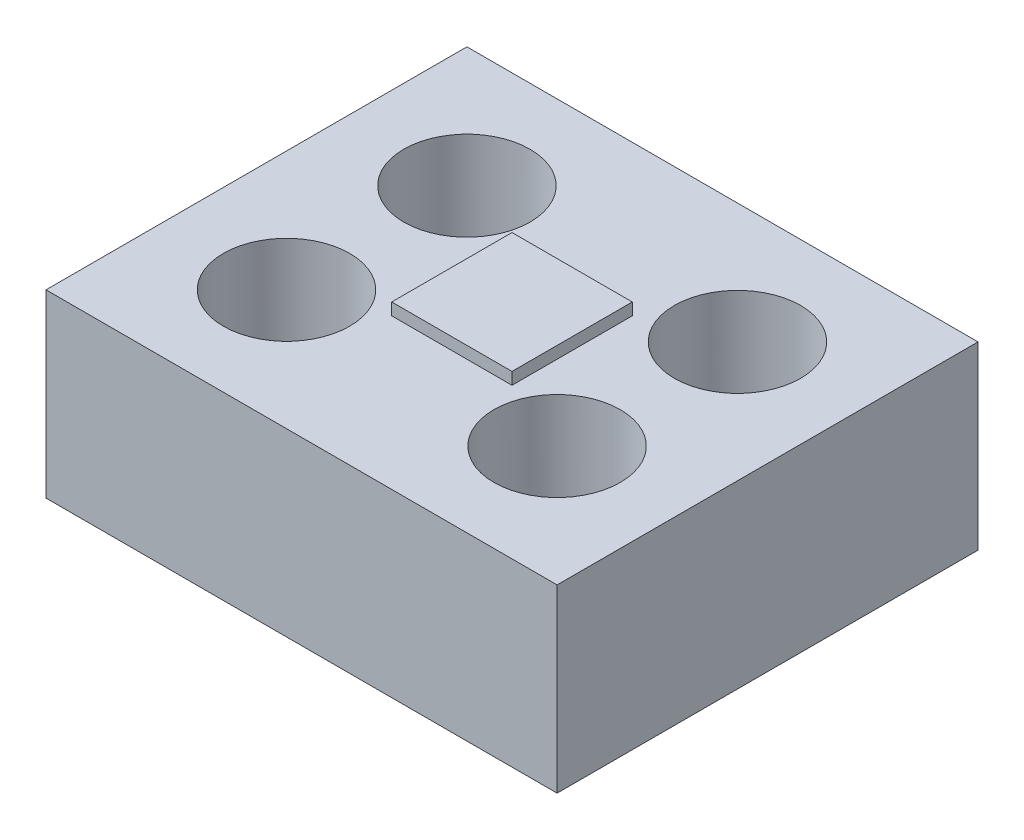
ISO-10303-21;
HEADER;
FILE_DESCRIPTION(('STEP AP214'),'2;1');
FILE_NAME('part.step','',(''),(''),'','','');
FILE_SCHEMA(('AUTOMOTIVE_DESIGN { 1 0 10303 214 1 1 1 1 }'));
ENDSEC;
DATA;
#1=APPLICATION_CONTEXT('core data for automotive mechanical design processes');
#2=APPLICATION_PROTOCOL_DEFINITION('international standard','automotive_design',2000,#1);
#3=PRODUCT_CONTEXT('',#1,'mechanical');
#4=PRODUCT('Part','Part','',(#3));
#5=PRODUCT_RELATED_PRODUCT_CATEGORY('part','',(#4));
#6=PRODUCT_DEFINITION_FORMATION('','',#4);
#7=PRODUCT_DEFINITION_CONTEXT('part definition',#1,'design');
#8=PRODUCT_DEFINITION('design','',#6,#7);
#9=PRODUCT_DEFINITION_SHAPE('','',#8);
#10=(LENGTH_UNIT() NAMED_UNIT(*) SI_UNIT(.MILLI.,.METRE.));
#11=(NAMED_UNIT(*) PLANE_ANGLE_UNIT() SI_UNIT($,.RADIAN.));
#12=(NAMED_UNIT(*) SI_UNIT($,.STERADIAN.) SOLID_ANGLE_UNIT());
#13=UNCERTAINTY_MEASURE_WITH_UNIT(LENGTH_MEASURE(1.E-05),#10,'distance_accuracy_value','');
#14=(GEOMETRIC_REPRESENTATION_CONTEXT(3) GLOBAL_UNCERTAINTY_ASSIGNED_CONTEXT((#13)) GLOBAL_UNIT_ASSIGNED_CONTEXT((#10,
#11,#12)) REPRESENTATION_CONTEXT('',''));
#15=CARTESIAN_POINT('',(0.,0.,0.));
#16=DIRECTION('',(0.,0.,1.));
#17=DIRECTION('',(1.,0.,0.));
#18=AXIS2_PLACEMENT_3D('',#15,#16,#17);
#19=CARTESIAN_POINT('',(0.,300.,0.));
#20=DIRECTION('',(0.,-1.,0.));
#21=DIRECTION('',(0.,0.,-1.));
#22=AXIS2_PLACEMENT_3D('',#19,#20,#21);
#23=PLANE('',#22);
#24=CARTESIAN_POINT('',(225.,300.,150.));
#25=DIRECTION('',(0.,1.,0.));
#26=DIRECTION('',(0.,0.,1.));
#27=AXIS2_PLACEMENT_3D('',#24,#25,#26);
#28=CIRCLE('',#27,105.);
#29=CARTESIAN_POINT('',(225.,300.,255.));
#30=VERTEX_POINT('',#29);
#31=EDGE_CURVE('E297',#30,#30,#28,.T.);
#32=ORIENTED_EDGE('',*,*,#31,.F.);
#33=EDGE_LOOP('',(#32));
#34=FACE_BOUND('',#33,.T.);
#35=CARTESIAN_POINT('',(225.,300.,-150.));
#36=DIRECTION('',(0.,1.,0.));
#37=DIRECTION('',(0.,0.,1.));
#38=AXIS2_PLACEMENT_3D('',#35,#36,#37);
#39=CIRCLE('',#38,105.);
#40=CARTESIAN_POINT('',(225.,300.,-44.9999999999999));
#41=VERTEX_POINT('',#40);
#42=EDGE_CURVE('E482',#41,#41,#39,.T.);
#43=ORIENTED_EDGE('',*,*,#42,.F.);
#44=EDGE_LOOP('',(#43));
#45=FACE_BOUND('',#44,.T.);
#46=CARTESIAN_POINT('',(-225.,300.,-150.));
#47=DIRECTION('',(0.,1.,0.));
#48=DIRECTION('',(0.,0.,1.));
#49=AXIS2_PLACEMENT_3D('',#46,#47,#48);
#50=CIRCLE('',#49,105.);
#51=CARTESIAN_POINT('',(-225.,300.,-45.));
#52=VERTEX_POINT('',#51);
#53=EDGE_CURVE('E329',#52,#52,#50,.T.);
#54=ORIENTED_EDGE('',*,*,#53,.F.);
#55=EDGE_LOOP('',(#54));
#56=FACE_BOUND('',#55,.T.);
#57=CARTESIAN_POINT('',(-225.,300.,150.));
#58=DIRECTION('',(0.,1.,0.));
#59=DIRECTION('',(0.,0.,1.));
#60=AXIS2_PLACEMENT_3D('',#57,#58,#59);
#61=CIRCLE('',#60,105.);
#62=CARTESIAN_POINT('',(-225.,300.,255.));
#63=VERTEX_POINT('',#62);
#64=EDGE_CURVE('E323',#63,#63,#61,.T.);
#65=ORIENTED_EDGE('',*,*,#64,.F.);
#66=EDGE_LOOP('',(#65));
#67=FACE_BOUND('',#66,.T.);
#68=DIRECTION('',(1.,0.,0.));
#69=VECTOR('',#68,1.);
#70=CARTESIAN_POINT('',(-425.,300.,350.));
#71=LINE('',#70,#69);
#72=CARTESIAN_POINT('',(-425.,300.,350.));
#73=VERTEX_POINT('',#72);
#74=CARTESIAN_POINT('',(425.,300.,350.));
#75=VERTEX_POINT('',#74);
#76=EDGE_CURVE('E238',#73,#75,#71,.T.);
#77=ORIENTED_EDGE('',*,*,#76,.T.);
#78=DIRECTION('',(0.,0.,1.));
#79=VECTOR('',#78,1.);
#80=CARTESIAN_POINT('',(425.,300.,-350.));
#81=LINE('',#80,#79);
#82=CARTESIAN_POINT('',(425.,300.,-350.));
#83=VERTEX_POINT('',#82);
#84=EDGE_CURVE('E333',#83,#75,#81,.T.);
#85=ORIENTED_EDGE('',*,*,#84,.F.);
#86=DIRECTION('',(1.,0.,0.));
#87=VECTOR('',#86,1.);
#88=CARTESIAN_POINT('',(-425.,300.,-350.));
#89=LINE('',#88,#87);
#90=CARTESIAN_POINT('',(-425.,300.,-350.));
#91=VERTEX_POINT('',#90);
#92=EDGE_CURVE('E337',#91,#83,#89,.T.);
#93=ORIENTED_EDGE('',*,*,#92,.F.);
#94=DIRECTION('',(0.,0.,1.));
#95=VECTOR('',#94,1.);
#96=CARTESIAN_POINT('',(-425.,300.,-350.));
#97=LINE('',#96,#95);
#98=EDGE_CURVE('E244',#91,#73,#97,.T.);
#99=ORIENTED_EDGE('',*,*,#98,.T.);
#100=EDGE_LOOP('',(#77,#85,#93,#99));
#101=FACE_BOUND('',#100,.T.);
#102=DIRECTION('',(0.,0.,1.));
#103=VECTOR('',#102,1.);
#104=CARTESIAN_POINT('',(-100.,300.,-100.));
#105=LINE('',#104,#103);
#106=CARTESIAN_POINT('',(-100.,300.,-100.));
#107=VERTEX_POINT('',#106);
#108=CARTESIAN_POINT('',(-100.,300.,100.));
#109=VERTEX_POINT('',#108);
#110=EDGE_CURVE('E131',#107,#109,#105,.T.);
#111=ORIENTED_EDGE('',*,*,#110,.F.);
#112=DIRECTION('',(-1.,0.,0.));
#113=VECTOR('',#112,1.);
#114=CARTESIAN_POINT('',(-100.,300.,-100.));
#115=LINE('',#114,#113);
#116=CARTESIAN_POINT('',(100.,300.,-100.));
#117=VERTEX_POINT('',#116);
#118=EDGE_CURVE('E135',#117,#107,#115,.T.);
#119=ORIENTED_EDGE('',*,*,#118,.F.);
#120=DIRECTION('',(0.,0.,-1.));
#121=VECTOR('',#120,1.);
#122=CARTESIAN_POINT('',(100.,300.,-100.));
#123=LINE('',#122,#121);
#124=CARTESIAN_POINT('',(100.,300.,100.));
#125=VERTEX_POINT('',#124);
#126=EDGE_CURVE('E641',#125,#117,#123,.T.);
#127=ORIENTED_EDGE('',*,*,#126,.F.);
#128=DIRECTION('',(1.,0.,0.));
#129=VECTOR('',#128,1.);
#130=CARTESIAN_POINT('',(-100.,300.,100.));
#131=LINE('',#130,#129);
#132=EDGE_CURVE('E651',#109,#125,#131,.T.);
#133=ORIENTED_EDGE('',*,*,#132,.F.);
#134=EDGE_LOOP('',(#111,#119,#127,#133));
#135=FACE_BOUND('',#134,.T.);
#136=ADVANCED_FACE('F113',(#34,#45,#56,#67,#101,#135),#23,.F.);
#137=CARTESIAN_POINT('',(-225.,300.,150.));
#138=DIRECTION('',(0.,-1.,0.));
#139=DIRECTION('',(0.,0.,-1.));
#140=AXIS2_PLACEMENT_3D('',#137,#138,#139);
#141=CYLINDRICAL_SURFACE('',#140,105.);
#142=ORIENTED_EDGE('',*,*,#64,.T.);
#143=EDGE_LOOP('',(#142));
#144=FACE_BOUND('',#143,.T.);
#145=CARTESIAN_POINT('',(-225.,100.,150.));
#146=DIRECTION('',(0.,-1.,0.));
#147=DIRECTION('',(0.,0.,-1.));
#148=AXIS2_PLACEMENT_3D('',#145,#146,#147);
#149=CIRCLE('',#148,105.);
#150=CARTESIAN_POINT('',(-225.,100.,45.));
#151=VERTEX_POINT('',#150);
#152=EDGE_CURVE('E286',#151,#151,#149,.T.);
#153=ORIENTED_EDGE('',*,*,#152,.T.);
#154=EDGE_LOOP('',(#153));
#155=FACE_BOUND('',#154,.T.);
#156=ADVANCED_FACE('F439',(#144,#155),#141,.F.);
#157=CARTESIAN_POINT('',(-225.,300.,-150.));
#158=DIRECTION('',(0.,-1.,0.));
#159=DIRECTION('',(0.,0.,-1.));
#160=AXIS2_PLACEMENT_3D('',#157,#158,#159);
#161=CYLINDRICAL_SURFACE('',#160,105.);
#162=ORIENTED_EDGE('',*,*,#53,.T.);
#163=EDGE_LOOP('',(#162));
#164=FACE_BOUND('',#163,.T.);
#165=CARTESIAN_POINT('',(-225.,100.,-150.));
#166=DIRECTION('',(0.,-1.,0.));
#167=DIRECTION('',(0.,0.,-1.));
#168=AXIS2_PLACEMENT_3D('',#165,#166,#167);
#169=CIRCLE('',#168,105.);
#170=CARTESIAN_POINT('',(-225.,100.,-255.));
#171=VERTEX_POINT('',#170);
#172=EDGE_CURVE('E283',#171,#171,#169,.T.);
#173=ORIENTED_EDGE('',*,*,#172,.T.);
#174=EDGE_LOOP('',(#173));
#175=FACE_BOUND('',#174,.T.);
#176=ADVANCED_FACE('F435',(#164,#175),#161,.F.);
#177=CARTESIAN_POINT('',(225.,300.,-150.));
#178=DIRECTION('',(0.,-1.,0.));
#179=DIRECTION('',(0.,0.,-1.));
#180=AXIS2_PLACEMENT_3D('',#177,#178,#179);
#181=CYLINDRICAL_SURFACE('',#180,105.);
#182=ORIENTED_EDGE('',*,*,#42,.T.);
#183=EDGE_LOOP('',(#182));
#184=FACE_BOUND('',#183,.T.);
#185=CARTESIAN_POINT('',(225.,100.,-150.));
#186=DIRECTION('',(0.,-1.,0.));
#187=DIRECTION('',(0.,0.,-1.));
#188=AXIS2_PLACEMENT_3D('',#185,#186,#187);
#189=CIRCLE('',#188,105.);
#190=CARTESIAN_POINT('',(225.,100.,-255.));
#191=VERTEX_POINT('',#190);
#192=EDGE_CURVE('E258',#191,#191,#189,.T.);
#193=ORIENTED_EDGE('',*,*,#192,.T.);
#194=EDGE_LOOP('',(#193));
#195=FACE_BOUND('',#194,.T.);
#196=ADVANCED_FACE('F431',(#184,#195),#181,.F.);
#197=CARTESIAN_POINT('',(225.,300.,150.));
#198=DIRECTION('',(0.,-1.,0.));
#199=DIRECTION('',(0.,0.,-1.));
#200=AXIS2_PLACEMENT_3D('',#197,#198,#199);
#201=CYLINDRICAL_SURFACE('',#200,105.);
#202=ORIENTED_EDGE('',*,*,#31,.T.);
#203=EDGE_LOOP('',(#202));
#204=FACE_BOUND('',#203,.T.);
#205=CARTESIAN_POINT('',(225.,100.,150.));
#206=DIRECTION('',(0.,-1.,0.));
#207=DIRECTION('',(0.,0.,-1.));
#208=AXIS2_PLACEMENT_3D('',#205,#206,#207);
#209=CIRCLE('',#208,105.);
#210=CARTESIAN_POINT('',(225.,100.,45.0000000000001));
#211=VERTEX_POINT('',#210);
#212=EDGE_CURVE('E254',#211,#211,#209,.T.);
#213=ORIENTED_EDGE('',*,*,#212,.T.);
#214=EDGE_LOOP('',(#213));
#215=FACE_BOUND('',#214,.T.);
#216=ADVANCED_FACE('F427',(#204,#215),#201,.F.);
#217=CARTESIAN_POINT('',(0.,0.,0.));
#218=DIRECTION('',(0.,-1.,0.));
#219=DIRECTION('',(0.,0.,-1.));
#220=AXIS2_PLACEMENT_3D('',#217,#218,#219);
#221=PLANE('',#220);
#222=DIRECTION('',(1.,0.,0.));
#223=VECTOR('',#222,1.);
#224=CARTESIAN_POINT('',(-425.,0.,350.));
#225=LINE('',#224,#223);
#226=CARTESIAN_POINT('',(-425.,0.,350.));
#227=VERTEX_POINT('',#226);
#228=CARTESIAN_POINT('',(425.,0.,350.));
#229=VERTEX_POINT('',#228);
#230=EDGE_CURVE('E328',#227,#229,#225,.T.);
#231=ORIENTED_EDGE('',*,*,#230,.F.);
#232=DIRECTION('',(0.,0.,1.));
#233=VECTOR('',#232,1.);
#234=CARTESIAN_POINT('',(-425.,0.,-350.));
#235=LINE('',#234,#233);
#236=CARTESIAN_POINT('',(-425.,0.,-350.));
#237=VERTEX_POINT('',#236);
#238=EDGE_CURVE('E233',#237,#227,#235,.T.);
#239=ORIENTED_EDGE('',*,*,#238,.F.);
#240=DIRECTION('',(1.,0.,0.));
#241=VECTOR('',#240,1.);
#242=CARTESIAN_POINT('',(-425.,0.,-350.));
#243=LINE('',#242,#241);
#244=CARTESIAN_POINT('',(425.,0.,-350.));
#245=VERTEX_POINT('',#244);
#246=EDGE_CURVE('E227',#237,#245,#243,.T.);
#247=ORIENTED_EDGE('',*,*,#246,.T.);
#248=DIRECTION('',(0.,0.,1.));
#249=VECTOR('',#248,1.);
#250=CARTESIAN_POINT('',(425.,0.,-350.));
#251=LINE('',#250,#249);
#252=EDGE_CURVE('E234',#245,#229,#251,.T.);
#253=ORIENTED_EDGE('',*,*,#252,.T.);
#254=EDGE_LOOP('',(#231,#239,#247,#253));
#255=FACE_BOUND('',#254,.T.);
#256=ADVANCED_FACE('F430',(#255),#221,.T.);
#257=CARTESIAN_POINT('',(-425.,300.,350.));
#258=DIRECTION('',(0.,0.,-1.));
#259=DIRECTION('',(-1.,0.,0.));
#260=AXIS2_PLACEMENT_3D('',#257,#258,#259);
#261=PLANE('',#260);
#262=ORIENTED_EDGE('',*,*,#230,.T.);
#263=DIRECTION('',(0.,-1.,0.));
#264=VECTOR('',#263,1.);
#265=CARTESIAN_POINT('',(425.,300.,350.));
#266=LINE('',#265,#264);
#267=EDGE_CURVE('E250',#75,#229,#266,.T.);
#268=ORIENTED_EDGE('',*,*,#267,.F.);
#269=ORIENTED_EDGE('',*,*,#76,.F.);
#270=DIRECTION('',(0.,-1.,0.));
#271=VECTOR('',#270,1.);
#272=CARTESIAN_POINT('',(-425.,300.,350.));
#273=LINE('',#272,#271);
#274=EDGE_CURVE('E239',#73,#227,#273,.T.);
#275=ORIENTED_EDGE('',*,*,#274,.T.);
#276=EDGE_LOOP('',(#262,#268,#269,#275));
#277=FACE_BOUND('',#276,.T.);
#278=ADVANCED_FACE('F115',(#277),#261,.F.);
#279=CARTESIAN_POINT('',(425.,300.,-350.));
#280=DIRECTION('',(1.,0.,0.));
#281=DIRECTION('',(0.,0.,-1.));
#282=AXIS2_PLACEMENT_3D('',#279,#280,#281);
#283=PLANE('',#282);
#284=ORIENTED_EDGE('',*,*,#252,.F.);
#285=DIRECTION('',(0.,-1.,0.));
#286=VECTOR('',#285,1.);
#287=CARTESIAN_POINT('',(425.,300.,-350.));
#288=LINE('',#287,#286);
#289=EDGE_CURVE('E247',#83,#245,#288,.T.);
#290=ORIENTED_EDGE('',*,*,#289,.F.);
#291=ORIENTED_EDGE('',*,*,#84,.T.);
#292=ORIENTED_EDGE('',*,*,#267,.T.);
#293=EDGE_LOOP('',(#284,#290,#291,#292));
#294=FACE_BOUND('',#293,.T.);
#295=ADVANCED_FACE('F456',(#294),#283,.T.);
#296=CARTESIAN_POINT('',(-425.,300.,-350.));
#297=DIRECTION('',(0.,0.,-1.));
#298=DIRECTION('',(-1.,0.,0.));
#299=AXIS2_PLACEMENT_3D('',#296,#297,#298);
#300=PLANE('',#299);
#301=ORIENTED_EDGE('',*,*,#246,.F.);
#302=DIRECTION('',(0.,-1.,0.));
#303=VECTOR('',#302,1.);
#304=CARTESIAN_POINT('',(-425.,300.,-350.));
#305=LINE('',#304,#303);
#306=EDGE_CURVE('E243',#91,#237,#305,.T.);
#307=ORIENTED_EDGE('',*,*,#306,.F.);
#308=ORIENTED_EDGE('',*,*,#92,.T.);
#309=ORIENTED_EDGE('',*,*,#289,.T.);
#310=EDGE_LOOP('',(#301,#307,#308,#309));
#311=FACE_BOUND('',#310,.T.);
#312=ADVANCED_FACE('F453',(#311),#300,.T.);
#313=CARTESIAN_POINT('',(-425.,300.,-350.));
#314=DIRECTION('',(1.,0.,0.));
#315=DIRECTION('',(0.,0.,-1.));
#316=AXIS2_PLACEMENT_3D('',#313,#314,#315);
#317=PLANE('',#316);
#318=ORIENTED_EDGE('',*,*,#238,.T.);
#319=ORIENTED_EDGE('',*,*,#274,.F.);
#320=ORIENTED_EDGE('',*,*,#98,.F.);
#321=ORIENTED_EDGE('',*,*,#306,.T.);
#322=EDGE_LOOP('',(#318,#319,#320,#321));
#323=FACE_BOUND('',#322,.T.);
#324=ADVANCED_FACE('F450',(#323),#317,.F.);
#325=CARTESIAN_POINT('',(0.,100.,0.));
#326=DIRECTION('',(0.,-1.,0.));
#327=DIRECTION('',(0.,0.,-1.));
#328=AXIS2_PLACEMENT_3D('',#325,#326,#327);
#329=PLANE('',#328);
#330=CARTESIAN_POINT('',(225.,100.,150.));
#331=DIRECTION('',(0.,-1.,0.));
#332=DIRECTION('',(0.,0.,-1.));
#333=AXIS2_PLACEMENT_3D('',#330,#331,#332);
#334=CIRCLE('',#333,30.);
#335=CARTESIAN_POINT('',(225.,100.,120.));
#336=VERTEX_POINT('',#335);
#337=EDGE_CURVE('E13',#336,#336,#334,.F.);
#338=ORIENTED_EDGE('',*,*,#337,.F.);
#339=EDGE_LOOP('',(#338));
#340=FACE_BOUND('',#339,.T.);
#341=ORIENTED_EDGE('',*,*,#212,.F.);
#342=EDGE_LOOP('',(#341));
#343=FACE_BOUND('',#342,.T.);
#344=ADVANCED_FACE('F277',(#340,#343),#329,.F.);
#345=CARTESIAN_POINT('',(225.,100.,-150.));
#346=DIRECTION('',(0.,-1.,0.));
#347=DIRECTION('',(0.,0.,-1.));
#348=AXIS2_PLACEMENT_3D('',#345,#346,#347);
#349=CIRCLE('',#348,30.);
#350=CARTESIAN_POINT('',(225.,100.,-180.));
#351=VERTEX_POINT('',#350);
#352=EDGE_CURVE('E124',#351,#351,#349,.F.);
#353=ORIENTED_EDGE('',*,*,#352,.F.);
#354=EDGE_LOOP('',(#353));
#355=FACE_BOUND('',#354,.T.);
#356=ORIENTED_EDGE('',*,*,#192,.F.);
#357=EDGE_LOOP('',(#356));
#358=FACE_BOUND('',#357,.T.);
#359=ADVANCED_FACE('F273',(#355,#358),#329,.F.);
#360=CARTESIAN_POINT('',(-225.,100.,-150.));
#361=DIRECTION('',(0.,-1.,0.));
#362=DIRECTION('',(0.,0.,-1.));
#363=AXIS2_PLACEMENT_3D('',#360,#361,#362);
#364=CIRCLE('',#363,30.);
#365=CARTESIAN_POINT('',(-225.,100.,-180.));
#366=VERTEX_POINT('',#365);
#367=EDGE_CURVE('E263',#366,#366,#364,.F.);
#368=ORIENTED_EDGE('',*,*,#367,.F.);
#369=EDGE_LOOP('',(#368));
#370=FACE_BOUND('',#369,.T.);
#371=ORIENTED_EDGE('',*,*,#172,.F.);
#372=EDGE_LOOP('',(#371));
#373=FACE_BOUND('',#372,.T.);
#374=ADVANCED_FACE('F276',(#370,#373),#329,.F.);
#375=CARTESIAN_POINT('',(-225.,100.,150.));
#376=DIRECTION('',(0.,-1.,0.));
#377=DIRECTION('',(0.,0.,-1.));
#378=AXIS2_PLACEMENT_3D('',#375,#376,#377);
#379=CIRCLE('',#378,30.);
#380=CARTESIAN_POINT('',(-225.,100.,120.));
#381=VERTEX_POINT('',#380);
#382=EDGE_CURVE('E253',#381,#381,#379,.F.);
#383=ORIENTED_EDGE('',*,*,#382,.F.);
#384=EDGE_LOOP('',(#383));
#385=FACE_BOUND('',#384,.T.);
#386=ORIENTED_EDGE('',*,*,#152,.F.);
#387=EDGE_LOOP('',(#386));
#388=FACE_BOUND('',#387,.T.);
#389=ADVANCED_FACE('F405',(#385,#388),#329,.F.);
#390=CARTESIAN_POINT('',(-225.,110.,150.));
#391=DIRECTION('',(0.,-1.,0.));
#392=DIRECTION('',(0.,0.,-1.));
#393=AXIS2_PLACEMENT_3D('',#390,#391,#392);
#394=CYLINDRICAL_SURFACE('',#393,30.);
#395=CARTESIAN_POINT('',(-225.,110.,150.));
#396=DIRECTION('',(0.,1.,0.));
#397=DIRECTION('',(0.,0.,1.));
#398=AXIS2_PLACEMENT_3D('',#395,#396,#397);
#399=CIRCLE('',#398,30.);
#400=CARTESIAN_POINT('',(-225.,110.,180.));
#401=VERTEX_POINT('',#400);
#402=EDGE_CURVE('E307',#401,#401,#399,.T.);
#403=ORIENTED_EDGE('',*,*,#402,.F.);
#404=EDGE_LOOP('',(#403));
#405=FACE_BOUND('',#404,.T.);
#406=ORIENTED_EDGE('',*,*,#382,.T.);
#407=EDGE_LOOP('',(#406));
#408=FACE_BOUND('',#407,.T.);
#409=ADVANCED_FACE('F402',(#405,#408),#394,.T.);
#410=CARTESIAN_POINT('',(-225.,110.,150.));
#411=DIRECTION('',(0.,1.,0.));
#412=DIRECTION('',(0.,0.,1.));
#413=AXIS2_PLACEMENT_3D('',#410,#411,#412);
#414=PLANE('',#413);
#415=ORIENTED_EDGE('',*,*,#402,.T.);
#416=EDGE_LOOP('',(#415));
#417=FACE_BOUND('',#416,.T.);
#418=ADVANCED_FACE('F397',(#417),#414,.T.);
#419=CARTESIAN_POINT('',(-225.,110.,-150.));
#420=DIRECTION('',(0.,-1.,0.));
#421=DIRECTION('',(0.,0.,-1.));
#422=AXIS2_PLACEMENT_3D('',#419,#420,#421);
#423=CYLINDRICAL_SURFACE('',#422,30.);
#424=CARTESIAN_POINT('',(-225.,110.,-150.));
#425=DIRECTION('',(0.,1.,0.));
#426=DIRECTION('',(0.,0.,1.));
#427=AXIS2_PLACEMENT_3D('',#424,#425,#426);
#428=CIRCLE('',#427,30.);
#429=CARTESIAN_POINT('',(-225.,110.,-120.));
#430=VERTEX_POINT('',#429);
#431=EDGE_CURVE('E313',#430,#430,#428,.T.);
#432=ORIENTED_EDGE('',*,*,#431,.F.);
#433=EDGE_LOOP('',(#432));
#434=FACE_BOUND('',#433,.T.);
#435=ORIENTED_EDGE('',*,*,#367,.T.);
#436=EDGE_LOOP('',(#435));
#437=FACE_BOUND('',#436,.T.);
#438=ADVANCED_FACE('F393',(#434,#437),#423,.T.);
#439=CARTESIAN_POINT('',(-225.,110.,-150.));
#440=DIRECTION('',(0.,1.,0.));
#441=DIRECTION('',(0.,0.,1.));
#442=AXIS2_PLACEMENT_3D('',#439,#440,#441);
#443=PLANE('',#442);
#444=ORIENTED_EDGE('',*,*,#431,.T.);
#445=EDGE_LOOP('',(#444));
#446=FACE_BOUND('',#445,.T.);
#447=ADVANCED_FACE('F396',(#446),#443,.T.);
#448=CARTESIAN_POINT('',(225.,110.,-150.));
#449=DIRECTION('',(0.,-1.,0.));
#450=DIRECTION('',(0.,0.,-1.));
#451=AXIS2_PLACEMENT_3D('',#448,#449,#450);
#452=CYLINDRICAL_SURFACE('',#451,30.);
#453=CARTESIAN_POINT('',(225.,110.,-150.));
#454=DIRECTION('',(0.,1.,0.));
#455=DIRECTION('',(0.,0.,1.));
#456=AXIS2_PLACEMENT_3D('',#453,#454,#455);
#457=CIRCLE('',#456,30.);
#458=CARTESIAN_POINT('',(225.,110.,-120.));
#459=VERTEX_POINT('',#458);
#460=EDGE_CURVE('E259',#459,#459,#457,.T.);
#461=ORIENTED_EDGE('',*,*,#460,.F.);
#462=EDGE_LOOP('',(#461));
#463=FACE_BOUND('',#462,.T.);
#464=ORIENTED_EDGE('',*,*,#352,.T.);
#465=EDGE_LOOP('',(#464));
#466=FACE_BOUND('',#465,.T.);
#467=ADVANCED_FACE('F271',(#463,#466),#452,.T.);
#468=CARTESIAN_POINT('',(225.,110.,-150.));
#469=DIRECTION('',(0.,1.,0.));
#470=DIRECTION('',(0.,0.,1.));
#471=AXIS2_PLACEMENT_3D('',#468,#469,#470);
#472=PLANE('',#471);
#473=ORIENTED_EDGE('',*,*,#460,.T.);
#474=EDGE_LOOP('',(#473));
#475=FACE_BOUND('',#474,.T.);
#476=ADVANCED_FACE('F414',(#475),#472,.T.);
#477=CARTESIAN_POINT('',(225.,110.,150.));
#478=DIRECTION('',(0.,-1.,0.));
#479=DIRECTION('',(0.,0.,-1.));
#480=AXIS2_PLACEMENT_3D('',#477,#478,#479);
#481=CYLINDRICAL_SURFACE('',#480,30.);
#482=CARTESIAN_POINT('',(225.,110.,150.));
#483=DIRECTION('',(0.,1.,0.));
#484=DIRECTION('',(0.,0.,1.));
#485=AXIS2_PLACEMENT_3D('',#482,#483,#484);
#486=CIRCLE('',#485,30.);
#487=CARTESIAN_POINT('',(225.,110.,180.));
#488=VERTEX_POINT('',#487);
#489=EDGE_CURVE('E303',#488,#488,#486,.T.);
#490=ORIENTED_EDGE('',*,*,#489,.F.);
#491=EDGE_LOOP('',(#490));
#492=FACE_BOUND('',#491,.T.);
#493=ORIENTED_EDGE('',*,*,#337,.T.);
#494=EDGE_LOOP('',(#493));
#495=FACE_BOUND('',#494,.T.);
#496=ADVANCED_FACE('F410',(#492,#495),#481,.T.);
#497=CARTESIAN_POINT('',(225.,110.,150.));
#498=DIRECTION('',(0.,1.,0.));
#499=DIRECTION('',(0.,0.,1.));
#500=AXIS2_PLACEMENT_3D('',#497,#498,#499);
#501=PLANE('',#500);
#502=ORIENTED_EDGE('',*,*,#489,.T.);
#503=EDGE_LOOP('',(#502));
#504=FACE_BOUND('',#503,.T.);
#505=ADVANCED_FACE('F413',(#504),#501,.T.);
#506=CARTESIAN_POINT('',(-100.,320.,-100.));
#507=DIRECTION('',(1.,0.,0.));
#508=DIRECTION('',(0.,0.,-1.));
#509=AXIS2_PLACEMENT_3D('',#506,#507,#508);
#510=PLANE('',#509);
#511=ORIENTED_EDGE('',*,*,#110,.T.);
#512=DIRECTION('',(0.,-1.,0.));
#513=VECTOR('',#512,1.);
#514=CARTESIAN_POINT('',(-100.,320.,100.));
#515=LINE('',#514,#513);
#516=CARTESIAN_POINT('',(-100.,320.,100.));
#517=VERTEX_POINT('',#516);
#518=EDGE_CURVE('E184',#517,#109,#515,.T.);
#519=ORIENTED_EDGE('',*,*,#518,.F.);
#520=DIRECTION('',(0.,0.,1.));
#521=VECTOR('',#520,1.);
#522=CARTESIAN_POINT('',(-100.,320.,-100.));
#523=LINE('',#522,#521);
#524=CARTESIAN_POINT('',(-100.,320.,-100.));
#525=VERTEX_POINT('',#524);
#526=EDGE_CURVE('E191',#525,#517,#523,.T.);
#527=ORIENTED_EDGE('',*,*,#526,.F.);
#528=DIRECTION('',(0.,-1.,0.));
#529=VECTOR('',#528,1.);
#530=CARTESIAN_POINT('',(-100.,320.,-100.));
#531=LINE('',#530,#529);
#532=EDGE_CURVE('E638',#525,#107,#531,.T.);
#533=ORIENTED_EDGE('',*,*,#532,.T.);
#534=EDGE_LOOP('',(#511,#519,#527,#533));
#535=FACE_BOUND('',#534,.T.);
#536=ADVANCED_FACE('F202',(#535),#510,.F.);
#537=CARTESIAN_POINT('',(-100.,320.,100.));
#538=DIRECTION('',(0.,0.,-1.));
#539=DIRECTION('',(-1.,0.,0.));
#540=AXIS2_PLACEMENT_3D('',#537,#538,#539);
#541=PLANE('',#540);
#542=ORIENTED_EDGE('',*,*,#132,.T.);
#543=DIRECTION('',(0.,-1.,0.));
#544=VECTOR('',#543,1.);
#545=CARTESIAN_POINT('',(100.,320.,100.));
#546=LINE('',#545,#544);
#547=CARTESIAN_POINT('',(100.,320.,100.));
#548=VERTEX_POINT('',#547);
#549=EDGE_CURVE('E186',#548,#125,#546,.T.);
#550=ORIENTED_EDGE('',*,*,#549,.F.);
#551=DIRECTION('',(1.,0.,0.));
#552=VECTOR('',#551,1.);
#553=CARTESIAN_POINT('',(-100.,320.,100.));
#554=LINE('',#553,#552);
#555=EDGE_CURVE('E179',#517,#548,#554,.T.);
#556=ORIENTED_EDGE('',*,*,#555,.F.);
#557=ORIENTED_EDGE('',*,*,#518,.T.);
#558=EDGE_LOOP('',(#542,#550,#556,#557));
#559=FACE_BOUND('',#558,.T.);
#560=ADVANCED_FACE('F182',(#559),#541,.F.);
#561=CARTESIAN_POINT('',(100.,320.,-100.));
#562=DIRECTION('',(-1.,0.,0.));
#563=DIRECTION('',(0.,0.,1.));
#564=AXIS2_PLACEMENT_3D('',#561,#562,#563);
#565=PLANE('',#564);
#566=ORIENTED_EDGE('',*,*,#126,.T.);
#567=DIRECTION('',(0.,-1.,0.));
#568=VECTOR('',#567,1.);
#569=CARTESIAN_POINT('',(100.,320.,-100.));
#570=LINE('',#569,#568);
#571=CARTESIAN_POINT('',(100.,320.,-100.));
#572=VERTEX_POINT('',#571);
#573=EDGE_CURVE('E211',#572,#117,#570,.T.);
#574=ORIENTED_EDGE('',*,*,#573,.F.);
#575=DIRECTION('',(0.,0.,-1.));
#576=VECTOR('',#575,1.);
#577=CARTESIAN_POINT('',(100.,320.,-100.));
#578=LINE('',#577,#576);
#579=EDGE_CURVE('E190',#548,#572,#578,.T.);
#580=ORIENTED_EDGE('',*,*,#579,.F.);
#581=ORIENTED_EDGE('',*,*,#549,.T.);
#582=EDGE_LOOP('',(#566,#574,#580,#581));
#583=FACE_BOUND('',#582,.T.);
#584=ADVANCED_FACE('F607',(#583),#565,.F.);
#585=CARTESIAN_POINT('',(-100.,320.,-100.));
#586=DIRECTION('',(0.,0.,1.));
#587=DIRECTION('',(1.,0.,0.));
#588=AXIS2_PLACEMENT_3D('',#585,#586,#587);
#589=PLANE('',#588);
#590=ORIENTED_EDGE('',*,*,#118,.T.);
#591=ORIENTED_EDGE('',*,*,#532,.F.);
#592=DIRECTION('',(-1.,0.,0.));
#593=VECTOR('',#592,1.);
#594=CARTESIAN_POINT('',(-100.,320.,-100.));
#595=LINE('',#594,#593);
#596=EDGE_CURVE('E196',#572,#525,#595,.T.);
#597=ORIENTED_EDGE('',*,*,#596,.F.);
#598=ORIENTED_EDGE('',*,*,#573,.T.);
#599=EDGE_LOOP('',(#590,#591,#597,#598));
#600=FACE_BOUND('',#599,.T.);
#601=ADVANCED_FACE('F616',(#600),#589,.F.);
#602=CARTESIAN_POINT('',(0.,320.,0.));
#603=DIRECTION('',(0.,1.,0.));
#604=DIRECTION('',(0.,0.,1.));
#605=AXIS2_PLACEMENT_3D('',#602,#603,#604);
#606=PLANE('',#605);
#607=ORIENTED_EDGE('',*,*,#526,.T.);
#608=ORIENTED_EDGE('',*,*,#555,.T.);
#609=ORIENTED_EDGE('',*,*,#579,.T.);
#610=ORIENTED_EDGE('',*,*,#596,.T.);
#611=EDGE_LOOP('',(#607,#608,#609,#610));
#612=FACE_BOUND('',#611,.T.);
#613=ADVANCED_FACE('F194',(#612),#606,.T.);
#614=CLOSED_SHELL('',(#136,#156,#176,#196,#216,#256,#278,#295,#312,#324,#344,#359,#374,#389,
#409,#418,#438,#447,#467,#476,#496,#505,#536,#560,#584,#601,#613));
#615=CARTESIAN_POINT('',(100.,150.,0.));
#616=DIRECTION('',(-1.,0.,0.));
#617=DIRECTION('',(0.,0.,1.));
#618=AXIS2_PLACEMENT_3D('',#615,#616,#617);
#619=CYLINDRICAL_SURFACE('',#618,141.);
#620=CARTESIAN_POINT('',(100.,150.,0.));
#621=DIRECTION('',(-1.,0.,0.));
#622=DIRECTION('',(0.,0.,1.));
#623=AXIS2_PLACEMENT_3D('',#620,#621,#622);
#624=CIRCLE('',#623,141.);
#625=CARTESIAN_POINT('',(100.,150.,141.));
#626=VERTEX_POINT('',#625);
#627=EDGE_CURVE('E308',#626,#626,#624,.T.);
#628=ORIENTED_EDGE('',*,*,#627,.F.);
#629=EDGE_LOOP('',(#628));
#630=FACE_BOUND('',#629,.T.);
#631=CARTESIAN_POINT('',(-100.,150.,0.));
#632=DIRECTION('',(-1.,0.,0.));
#633=DIRECTION('',(0.,0.,1.));
#634=AXIS2_PLACEMENT_3D('',#631,#632,#633);
#635=CIRCLE('',#634,141.);
#636=CARTESIAN_POINT('',(-99.9999999999999,150.,141.));
#637=VERTEX_POINT('',#636);
#638=EDGE_CURVE('E318',#637,#637,#635,.T.);
#639=ORIENTED_EDGE('',*,*,#638,.T.);
#640=EDGE_LOOP('',(#639));
#641=FACE_BOUND('',#640,.T.);
#642=ADVANCED_FACE('F380',(#630,#641),#619,.F.);
#643=CARTESIAN_POINT('',(100.,150.,0.));
#644=DIRECTION('',(-1.,0.,0.));
#645=DIRECTION('',(0.,0.,1.));
#646=AXIS2_PLACEMENT_3D('',#643,#644,#645);
#647=PLANE('',#646);
#648=CARTESIAN_POINT('',(100.,150.,0.));
#649=DIRECTION('',(-1.,0.,0.));
#650=DIRECTION('',(0.,0.,1.));
#651=AXIS2_PLACEMENT_3D('',#648,#649,#650);
#652=CIRCLE('',#651,50.);
#653=CARTESIAN_POINT('',(100.,150.,50.));
#654=VERTEX_POINT('',#653);
#655=EDGE_CURVE('E348',#654,#654,#652,.F.);
#656=ORIENTED_EDGE('',*,*,#655,.T.);
#657=EDGE_LOOP('',(#656));
#658=FACE_BOUND('',#657,.T.);
#659=ORIENTED_EDGE('',*,*,#627,.T.);
#660=EDGE_LOOP('',(#659));
#661=FACE_BOUND('',#660,.T.);
#662=ADVANCED_FACE('F377',(#658,#661),#647,.T.);
#663=CARTESIAN_POINT('',(-100.,150.,0.));
#664=DIRECTION('',(-1.,0.,0.));
#665=DIRECTION('',(0.,0.,1.));
#666=AXIS2_PLACEMENT_3D('',#663,#664,#665);
#667=PLANE('',#666);
#668=CARTESIAN_POINT('',(-100.,150.,0.));
#669=DIRECTION('',(-1.,0.,0.));
#670=DIRECTION('',(0.,0.,1.));
#671=AXIS2_PLACEMENT_3D('',#668,#669,#670);
#672=CIRCLE('',#671,50.);
#673=CARTESIAN_POINT('',(-100.,150.,50.));
#674=VERTEX_POINT('',#673);
#675=EDGE_CURVE('E117',#674,#674,#672,.F.);
#676=ORIENTED_EDGE('',*,*,#675,.F.);
#677=EDGE_LOOP('',(#676));
#678=FACE_BOUND('',#677,.T.);
#679=ORIENTED_EDGE('',*,*,#638,.F.);
#680=EDGE_LOOP('',(#679));
#681=FACE_BOUND('',#680,.T.);
#682=ADVANCED_FACE('F367',(#678,#681),#667,.F.);
#683=CARTESIAN_POINT('',(-120.,150.,0.));
#684=DIRECTION('',(-1.,0.,0.));
#685=DIRECTION('',(0.,0.,1.));
#686=AXIS2_PLACEMENT_3D('',#683,#684,#685);
#687=PLANE('',#686);
#688=CARTESIAN_POINT('',(-120.,150.,0.));
#689=DIRECTION('',(-1.,0.,0.));
#690=DIRECTION('',(0.,0.,1.));
#691=AXIS2_PLACEMENT_3D('',#688,#689,#690);
#692=CIRCLE('',#691,50.);
#693=CARTESIAN_POINT('',(-120.,150.,50.));
#694=VERTEX_POINT('',#693);
#695=EDGE_CURVE('E209',#694,#694,#692,.T.);
#696=ORIENTED_EDGE('',*,*,#695,.F.);
#697=EDGE_LOOP('',(#696));
#698=FACE_BOUND('',#697,.T.);
#699=ADVANCED_FACE('F365',(#698),#687,.F.);
#700=CARTESIAN_POINT('',(-120.,150.,0.));
#701=DIRECTION('',(1.,0.,0.));
#702=DIRECTION('',(0.,0.,-1.));
#703=AXIS2_PLACEMENT_3D('',#700,#701,#702);
#704=CYLINDRICAL_SURFACE('',#703,50.);
#705=ORIENTED_EDGE('',*,*,#695,.T.);
#706=EDGE_LOOP('',(#705));
#707=FACE_BOUND('',#706,.T.);
#708=ORIENTED_EDGE('',*,*,#675,.T.);
#709=EDGE_LOOP('',(#708));
#710=FACE_BOUND('',#709,.T.);
#711=ADVANCED_FACE('F363',(#707,#710),#704,.F.);
#712=ORIENTED_EDGE('',*,*,#655,.F.);
#713=EDGE_LOOP('',(#712));
#714=FACE_BOUND('',#713,.T.);
#715=CARTESIAN_POINT('',(120.,150.,0.));
#716=DIRECTION('',(-1.,0.,0.));
#717=DIRECTION('',(0.,0.,1.));
#718=AXIS2_PLACEMENT_3D('',#715,#716,#717);
#719=CIRCLE('',#718,50.);
#720=CARTESIAN_POINT('',(120.,150.,50.));
#721=VERTEX_POINT('',#720);
#722=EDGE_CURVE('E204',#721,#721,#719,.T.);
#723=ORIENTED_EDGE('',*,*,#722,.F.);
#724=EDGE_LOOP('',(#723));
#725=FACE_BOUND('',#724,.T.);
#726=ADVANCED_FACE('F375',(#714,#725),#704,.F.);
#727=CARTESIAN_POINT('',(120.,150.,0.));
#728=DIRECTION('',(-1.,0.,0.));
#729=DIRECTION('',(0.,0.,1.));
#730=AXIS2_PLACEMENT_3D('',#727,#728,#729);
#731=PLANE('',#730);
#732=ORIENTED_EDGE('',*,*,#722,.T.);
#733=EDGE_LOOP('',(#732));
#734=FACE_BOUND('',#733,.T.);
#735=ADVANCED_FACE('F562',(#734),#731,.T.);
#736=CLOSED_SHELL('',(#642,#662,#682,#699,#711,#726,#735));
#737=ORIENTED_CLOSED_SHELL('',*,#736,.T.);
#738=BREP_WITH_VOIDS('B2',#614,(#737));
#739=ADVANCED_BREP_SHAPE_REPRESENTATION('',(#18,#738),#14);
#740=SHAPE_DEFINITION_REPRESENTATION(#9,#739);
ENDSEC;
END-ISO-10303-21;
